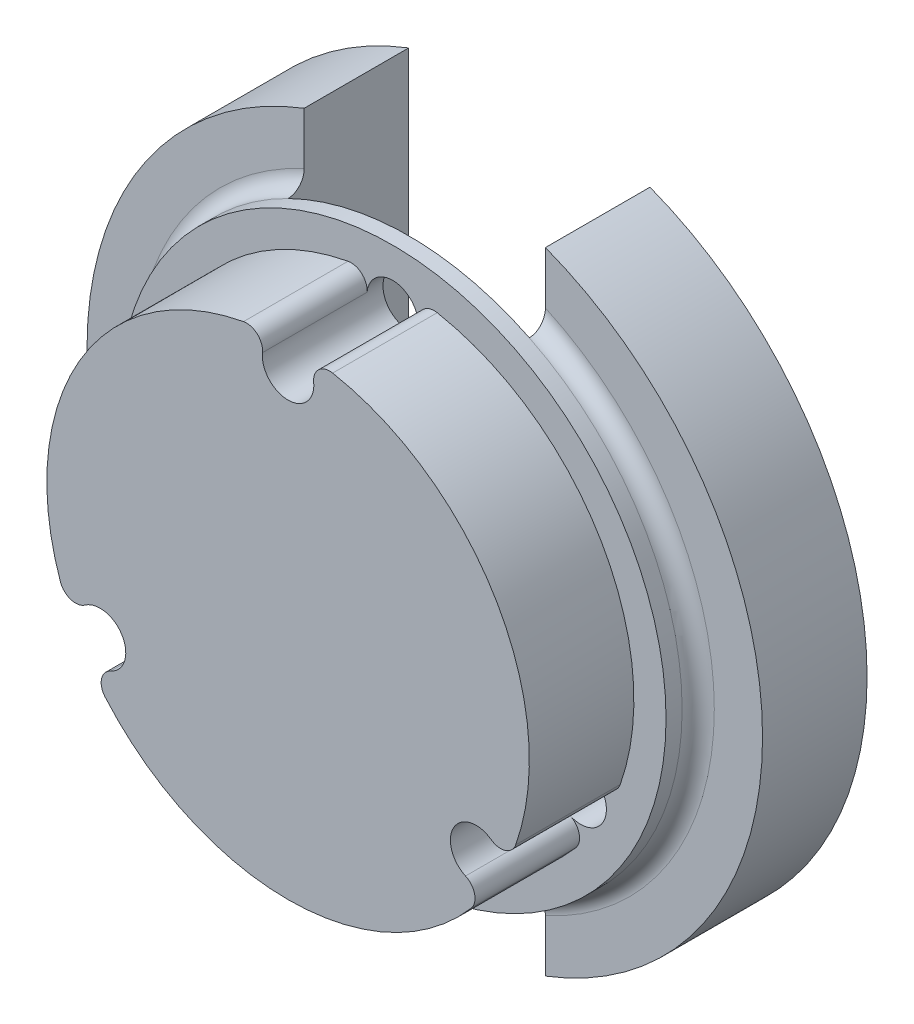
ISO-10303-21;
HEADER;
FILE_DESCRIPTION(('STEP AP214'),'2;1');
FILE_NAME('part.step','',(''),(''),'','','');
FILE_SCHEMA(('AUTOMOTIVE_DESIGN { 1 0 10303 214 1 1 1 1 }'));
ENDSEC;
DATA;
#1=APPLICATION_CONTEXT('core data for automotive mechanical design processes');
#2=APPLICATION_PROTOCOL_DEFINITION('international standard','automotive_design',2000,#1);
#3=PRODUCT_CONTEXT('',#1,'mechanical');
#4=PRODUCT('Part','Part','',(#3));
#5=PRODUCT_RELATED_PRODUCT_CATEGORY('part','',(#4));
#6=PRODUCT_DEFINITION_FORMATION('','',#4);
#7=PRODUCT_DEFINITION_CONTEXT('part definition',#1,'design');
#8=PRODUCT_DEFINITION('design','',#6,#7);
#9=PRODUCT_DEFINITION_SHAPE('','',#8);
#10=(LENGTH_UNIT() NAMED_UNIT(*) SI_UNIT(.MILLI.,.METRE.));
#11=(NAMED_UNIT(*) PLANE_ANGLE_UNIT() SI_UNIT($,.RADIAN.));
#12=(NAMED_UNIT(*) SI_UNIT($,.STERADIAN.) SOLID_ANGLE_UNIT());
#13=UNCERTAINTY_MEASURE_WITH_UNIT(LENGTH_MEASURE(1.E-05),#10,'distance_accuracy_value','');
#14=(GEOMETRIC_REPRESENTATION_CONTEXT(3) GLOBAL_UNCERTAINTY_ASSIGNED_CONTEXT((#13)) GLOBAL_UNIT_ASSIGNED_CONTEXT((#10,
#11,#12)) REPRESENTATION_CONTEXT('',''));
#15=CARTESIAN_POINT('',(0.,0.,0.));
#16=DIRECTION('',(0.,0.,1.));
#17=DIRECTION('',(1.,0.,0.));
#18=AXIS2_PLACEMENT_3D('',#15,#16,#17);
#19=CARTESIAN_POINT('',(0.,0.,-8.5));
#20=DIRECTION('',(0.,0.,1.));
#21=DIRECTION('',(1.,0.,0.));
#22=AXIS2_PLACEMENT_3D('',#19,#20,#21);
#23=CYLINDRICAL_SURFACE('',#22,21.);
#24=CARTESIAN_POINT('',(0.,0.,-2.));
#25=DIRECTION('',(0.,0.,1.));
#26=DIRECTION('',(1.,0.,0.));
#27=AXIS2_PLACEMENT_3D('',#24,#25,#26);
#28=CIRCLE('',#27,21.);
#29=CARTESIAN_POINT('',(-7.5,19.615045245933,-2.));
#30=VERTEX_POINT('',#29);
#31=CARTESIAN_POINT('',(-7.5,-19.615045245933,-2.));
#32=VERTEX_POINT('',#31);
#33=EDGE_CURVE('E489',#30,#32,#28,.T.);
#34=ORIENTED_EDGE('',*,*,#33,.F.);
#35=DIRECTION('',(0.,0.,1.));
#36=VECTOR('',#35,1.);
#37=CARTESIAN_POINT('',(-7.5,19.615045245933,-8.5));
#38=LINE('',#37,#36);
#39=CARTESIAN_POINT('',(-7.5,19.615045245933,-8.5));
#40=VERTEX_POINT('',#39);
#41=EDGE_CURVE('E466',#30,#40,#38,.F.);
#42=ORIENTED_EDGE('',*,*,#41,.T.);
#43=CARTESIAN_POINT('',(0.,0.,-8.5));
#44=DIRECTION('',(0.,0.,-1.));
#45=DIRECTION('',(-1.,0.,0.));
#46=AXIS2_PLACEMENT_3D('',#43,#44,#45);
#47=CIRCLE('',#46,21.);
#48=CARTESIAN_POINT('',(-7.5,-19.615045245933,-8.5));
#49=VERTEX_POINT('',#48);
#50=EDGE_CURVE('E439',#49,#40,#47,.T.);
#51=ORIENTED_EDGE('',*,*,#50,.F.);
#52=DIRECTION('',(0.,0.,1.));
#53=VECTOR('',#52,1.);
#54=CARTESIAN_POINT('',(-7.5,-19.615045245933,-8.5));
#55=LINE('',#54,#53);
#56=EDGE_CURVE('E459',#49,#32,#55,.T.);
#57=ORIENTED_EDGE('',*,*,#56,.T.);
#58=EDGE_LOOP('',(#34,#42,#51,#57));
#59=FACE_BOUND('',#58,.T.);
#60=ADVANCED_FACE('F45',(#59),#23,.T.);
#61=CARTESIAN_POINT('',(7.5,-19.615045245933,-2.));
#62=VERTEX_POINT('',#61);
#63=CARTESIAN_POINT('',(7.5,19.615045245933,-2.));
#64=VERTEX_POINT('',#63);
#65=EDGE_CURVE('E490',#62,#64,#28,.T.);
#66=ORIENTED_EDGE('',*,*,#65,.F.);
#67=DIRECTION('',(0.,0.,1.));
#68=VECTOR('',#67,1.);
#69=CARTESIAN_POINT('',(7.5,-19.615045245933,-8.5));
#70=LINE('',#69,#68);
#71=CARTESIAN_POINT('',(7.5,-19.615045245933,-8.5));
#72=VERTEX_POINT('',#71);
#73=EDGE_CURVE('E427',#62,#72,#70,.F.);
#74=ORIENTED_EDGE('',*,*,#73,.T.);
#75=CARTESIAN_POINT('',(7.5,19.615045245933,-8.5));
#76=VERTEX_POINT('',#75);
#77=EDGE_CURVE('E375',#76,#72,#47,.T.);
#78=ORIENTED_EDGE('',*,*,#77,.F.);
#79=DIRECTION('',(0.,0.,1.));
#80=VECTOR('',#79,1.);
#81=CARTESIAN_POINT('',(7.5,19.615045245933,-8.5));
#82=LINE('',#81,#80);
#83=EDGE_CURVE('E469',#76,#64,#82,.T.);
#84=ORIENTED_EDGE('',*,*,#83,.T.);
#85=EDGE_LOOP('',(#66,#74,#78,#84));
#86=FACE_BOUND('',#85,.T.);
#87=ADVANCED_FACE('F291',(#86),#23,.T.);
#88=CARTESIAN_POINT('',(0.,0.,0.));
#89=DIRECTION('',(0.,0.,-1.));
#90=DIRECTION('',(-1.,0.,0.));
#91=AXIS2_PLACEMENT_3D('',#88,#89,#90);
#92=PLANE('',#91);
#93=CARTESIAN_POINT('',(0.,0.,0.));
#94=DIRECTION('',(0.,0.,1.));
#95=DIRECTION('',(1.,0.,0.));
#96=AXIS2_PLACEMENT_3D('',#93,#94,#95);
#97=CIRCLE('',#96,15.);
#98=CARTESIAN_POINT('',(-2.7718701067851,14.7416666666667,0.));
#99=VERTEX_POINT('',#98);
#100=CARTESIAN_POINT('',(-14.1525928808485,-4.97032340486578,0.));
#101=VERTEX_POINT('',#100);
#102=EDGE_CURVE('E333',#99,#101,#97,.T.);
#103=ORIENTED_EDGE('',*,*,#102,.F.);
#104=CARTESIAN_POINT('',(-2.58707876633276,13.7588888888889,0.));
#105=DIRECTION('',(0.,0.,-1.));
#106=DIRECTION('',(-1.,0.,0.));
#107=AXIS2_PLACEMENT_3D('',#104,#105,#106);
#108=CIRCLE('',#107,1.);
#109=CARTESIAN_POINT('',(-1.5920484715894,13.6593162393162,0.));
#110=VERTEX_POINT('',#109);
#111=EDGE_CURVE('E330',#99,#110,#108,.T.);
#112=ORIENTED_EDGE('',*,*,#111,.T.);
#113=CARTESIAN_POINT('',(0.,13.5,0.));
#114=DIRECTION('',(0.,0.,-1.));
#115=DIRECTION('',(-1.,0.,0.));
#116=AXIS2_PLACEMENT_3D('',#113,#114,#115);
#117=CIRCLE('',#116,1.6);
#118=CARTESIAN_POINT('',(1.5920484715894,13.6593162393162,0.));
#119=VERTEX_POINT('',#118);
#120=EDGE_CURVE('E316',#110,#119,#117,.T.);
#121=ORIENTED_EDGE('',*,*,#120,.T.);
#122=CARTESIAN_POINT('',(2.58707876633276,13.7588888888889,0.));
#123=DIRECTION('',(0.,0.,-1.));
#124=DIRECTION('',(-1.,0.,0.));
#125=AXIS2_PLACEMENT_3D('',#122,#123,#124);
#126=CIRCLE('',#125,1.);
#127=CARTESIAN_POINT('',(2.7718701067851,14.7416666666667,0.));
#128=VERTEX_POINT('',#127);
#129=EDGE_CURVE('E210',#119,#128,#126,.T.);
#130=ORIENTED_EDGE('',*,*,#129,.T.);
#131=CARTESIAN_POINT('',(14.1525928808478,-4.97032340486769,0.));
#132=VERTEX_POINT('',#131);
#133=EDGE_CURVE('E364',#132,#128,#97,.T.);
#134=ORIENTED_EDGE('',*,*,#133,.F.);
#135=CARTESIAN_POINT('',(13.2090866887913,-4.63896851120985,0.));
#136=DIRECTION('',(0.,0.,-1.));
#137=DIRECTION('',(-1.,0.,0.));
#138=AXIS2_PLACEMENT_3D('',#135,#136,#137);
#139=CIRCLE('',#138,1.);
#140=CARTESIAN_POINT('',(12.6253390973674,-5.45090369920625,0.));
#141=VERTEX_POINT('',#140);
#142=EDGE_CURVE('E337',#132,#141,#139,.T.);
#143=ORIENTED_EDGE('',*,*,#142,.T.);
#144=CARTESIAN_POINT('',(11.6913429510891,-6.75000000000049,0.));
#145=DIRECTION('',(0.,0.,-1.));
#146=DIRECTION('',(-1.,0.,0.));
#147=AXIS2_PLACEMENT_3D('',#144,#145,#146);
#148=CIRCLE('',#147,1.6);
#149=CARTESIAN_POINT('',(11.0332906257778,-8.2084125401113,0.));
#150=VERTEX_POINT('',#149);
#151=EDGE_CURVE('E431',#141,#150,#148,.T.);
#152=ORIENTED_EDGE('',*,*,#151,.T.);
#153=CARTESIAN_POINT('',(10.6220079224583,-9.11992037768056,0.));
#154=DIRECTION('',(0.,0.,-1.));
#155=DIRECTION('',(-1.,0.,0.));
#156=AXIS2_PLACEMENT_3D('',#153,#154,#155);
#157=CIRCLE('',#156,1.);
#158=CARTESIAN_POINT('',(11.3807227740625,-9.7713432618006,0.));
#159=VERTEX_POINT('',#158);
#160=EDGE_CURVE('E355',#150,#159,#157,.T.);
#161=ORIENTED_EDGE('',*,*,#160,.T.);
#162=CARTESIAN_POINT('',(-11.3807227740636,-9.77134326179924,0.));
#163=VERTEX_POINT('',#162);
#164=EDGE_CURVE('E374',#163,#159,#97,.T.);
#165=ORIENTED_EDGE('',*,*,#164,.F.);
#166=CARTESIAN_POINT('',(-10.6220079224594,-9.11992037767929,0.));
#167=DIRECTION('',(0.,0.,-1.));
#168=DIRECTION('',(-1.,0.,0.));
#169=AXIS2_PLACEMENT_3D('',#166,#167,#168);
#170=CIRCLE('',#169,1.);
#171=CARTESIAN_POINT('',(-11.0332906257792,-8.20841254011014,0.));
#172=VERTEX_POINT('',#171);
#173=EDGE_CURVE('E342',#163,#172,#170,.T.);
#174=ORIENTED_EDGE('',*,*,#173,.T.);
#175=CARTESIAN_POINT('',(-11.6913429510908,-6.7499999999995,0.));
#176=DIRECTION('',(0.,0.,-1.));
#177=DIRECTION('',(-1.,0.,0.));
#178=AXIS2_PLACEMENT_3D('',#175,#176,#177);
#179=CIRCLE('',#178,1.6);
#180=CARTESIAN_POINT('',(-12.6253390973684,-5.45090369920477,0.));
#181=VERTEX_POINT('',#180);
#182=EDGE_CURVE('E327',#172,#181,#179,.T.);
#183=ORIENTED_EDGE('',*,*,#182,.T.);
#184=CARTESIAN_POINT('',(-13.2090866887919,-4.63896851120806,0.));
#185=DIRECTION('',(0.,0.,-1.));
#186=DIRECTION('',(-1.,0.,0.));
#187=AXIS2_PLACEMENT_3D('',#184,#185,#186);
#188=CIRCLE('',#187,1.);
#189=EDGE_CURVE('E347',#181,#101,#188,.T.);
#190=ORIENTED_EDGE('',*,*,#189,.T.);
#191=EDGE_LOOP('',(#103,#112,#121,#130,#134,#143,#152,#161,#165,#174,#183,#190));
#192=FACE_BOUND('',#191,.T.);
#193=CARTESIAN_POINT('',(0.,0.,0.));
#194=DIRECTION('',(0.,0.,1.));
#195=DIRECTION('',(1.,0.,0.));
#196=AXIS2_PLACEMENT_3D('',#193,#194,#195);
#197=CIRCLE('',#196,17.);
#198=CARTESIAN_POINT('',(17.,0.,0.));
#199=VERTEX_POINT('',#198);
#200=EDGE_CURVE('E493',#199,#199,#197,.T.);
#201=ORIENTED_EDGE('',*,*,#200,.T.);
#202=EDGE_LOOP('',(#201));
#203=FACE_BOUND('',#202,.T.);
#204=ADVANCED_FACE('F293',(#192,#203),#92,.F.);
#205=CARTESIAN_POINT('',(-7.5,-25.,-1.));
#206=DIRECTION('',(-1.,0.,0.));
#207=DIRECTION('',(0.,0.,1.));
#208=AXIS2_PLACEMENT_3D('',#205,#206,#207);
#209=PLANE('',#208);
#210=DIRECTION('',(0.,1.,0.));
#211=VECTOR('',#210,1.);
#212=CARTESIAN_POINT('',(-7.5,-25.,-2.));
#213=LINE('',#212,#211);
#214=CARTESIAN_POINT('',(-7.5,-16.3630681719536,-2.));
#215=VERTEX_POINT('',#214);
#216=EDGE_CURVE('E482',#32,#215,#213,.T.);
#217=ORIENTED_EDGE('',*,*,#216,.F.);
#218=ORIENTED_EDGE('',*,*,#56,.F.);
#219=DIRECTION('',(0.,1.,0.));
#220=VECTOR('',#219,1.);
#221=CARTESIAN_POINT('',(-7.5,-25.,-8.5));
#222=LINE('',#221,#220);
#223=EDGE_CURVE('E479',#49,#40,#222,.T.);
#224=ORIENTED_EDGE('',*,*,#223,.T.);
#225=ORIENTED_EDGE('',*,*,#41,.F.);
#226=CARTESIAN_POINT('',(-7.5,16.3630681719536,-2.));
#227=VERTEX_POINT('',#226);
#228=EDGE_CURVE('E486',#227,#30,#213,.T.);
#229=ORIENTED_EDGE('',*,*,#228,.F.);
#230=CARTESIAN_POINT('',(-7.5,16.3630681719536,-2.));
#231=CARTESIAN_POINT('',(-7.5,16.2958703614829,-2.0000213400489));
#232=CARTESIAN_POINT('',(-7.5,16.2286597714599,-1.99440257758259));
#233=CARTESIAN_POINT('',(-7.5,16.0959538245753,-1.97208049340124));
#234=CARTESIAN_POINT('',(-7.5,16.030462616216,-1.95535253979532));
#235=CARTESIAN_POINT('',(-7.5,15.9031736113708,-1.91098219102147));
#236=CARTESIAN_POINT('',(-7.5,15.8413804694591,-1.88332636086836));
#237=CARTESIAN_POINT('',(-7.5,15.7236692163626,-1.81755125479782));
#238=CARTESIAN_POINT('',(-7.5,15.6677457875231,-1.77944156465809));
#239=CARTESIAN_POINT('',(-7.5,15.5664206665172,-1.6955452343627));
#240=CARTESIAN_POINT('',(-7.5,15.5206429617394,-1.6502144898123));
#241=CARTESIAN_POINT('',(-7.5,15.4383756935423,-1.55173717647318));
#242=CARTESIAN_POINT('',(-7.5,15.4018833185516,-1.49859298128373));
#243=CARTESIAN_POINT('',(-7.5,15.3432574161808,-1.39178678130391));
#244=CARTESIAN_POINT('',(-7.5,15.3200495713483,-1.33871332360208));
#245=CARTESIAN_POINT('',(-7.5,15.2839582924566,-1.2292182665535));
#246=CARTESIAN_POINT('',(-7.5,15.271051140814,-1.17280468181757));
#247=CARTESIAN_POINT('',(-7.5,15.2611420539218,-1.09656195676813));
#248=CARTESIAN_POINT('',(-7.5,15.2592687956364,-1.07728293002192));
#249=CARTESIAN_POINT('',(-7.5,15.2567725672473,-1.03867264506556));
#250=CARTESIAN_POINT('',(-7.5,15.2561477565411,-1.01934150588482));
#251=CARTESIAN_POINT('',(-7.5,15.2561463023924,-1.));
#252=B_SPLINE_CURVE_WITH_KNOTS('',3,(#230,#231,#232,#233,#234,#235,#236,#237,#238,#239,#240,
#241,#242,#243,#244,#245,#246,#247,#248,#249,#250,#251),.UNSPECIFIED.,.F.,.F.,(4,2,2,2,2,2,2,2,
2,2,4),(0.,0.201385110988452,0.40321824126273,0.605300285804222,0.807197644949003,
0.99941110462578,1.19156629316846,1.36441438834829,1.53686333919624,1.59494283390534,
1.65293663789647),.UNSPECIFIED.);
#253=CARTESIAN_POINT('',(-7.5,15.2561463023924,-1.));
#254=VERTEX_POINT('',#253);
#255=EDGE_CURVE('E238',#227,#254,#252,.T.);
#256=ORIENTED_EDGE('',*,*,#255,.T.);
#257=DIRECTION('',(0.,1.,0.));
#258=VECTOR('',#257,1.);
#259=CARTESIAN_POINT('',(-7.5,-25.,-1.));
#260=LINE('',#259,#258);
#261=CARTESIAN_POINT('',(-7.5,-15.2561463023924,-1.));
#262=VERTEX_POINT('',#261);
#263=EDGE_CURVE('E215',#262,#254,#260,.T.);
#264=ORIENTED_EDGE('',*,*,#263,.F.);
#265=CARTESIAN_POINT('',(-7.5,-15.2561463023924,-1.));
#266=CARTESIAN_POINT('',(-7.5,-15.2561448866001,-1.02610100234969));
#267=CARTESIAN_POINT('',(-7.5,-15.257285839046,-1.05218862332931));
#268=CARTESIAN_POINT('',(-7.5,-15.2618267743395,-1.10415948141705));
#269=CARTESIAN_POINT('',(-7.5,-15.2652261405353,-1.13004277236519));
#270=CARTESIAN_POINT('',(-7.5,-15.2787341850511,-1.20691320046413));
#271=CARTESIAN_POINT('',(-7.5,-15.2921533351564,-1.25735549091556));
#272=CARTESIAN_POINT('',(-7.5,-15.3272106990856,-1.35521613797853));
#273=CARTESIAN_POINT('',(-7.5,-15.3488440493175,-1.40263626463412));
#274=CARTESIAN_POINT('',(-7.5,-15.3994528118032,-1.49340479901425));
#275=CARTESIAN_POINT('',(-7.5,-15.4284329897069,-1.53675053870204));
#276=CARTESIAN_POINT('',(-7.5,-15.4940680439291,-1.62021006613832));
#277=CARTESIAN_POINT('',(-7.5,-15.5309976099712,-1.66010705844828));
#278=CARTESIAN_POINT('',(-7.5,-15.6104938034295,-1.73380313449628));
#279=CARTESIAN_POINT('',(-7.5,-15.6530619400589,-1.76760057989466));
#280=CARTESIAN_POINT('',(-7.5,-15.7470126260077,-1.83159470190634));
#281=CARTESIAN_POINT('',(-7.5,-15.7988496639297,-1.86112384448984));
#282=CARTESIAN_POINT('',(-7.5,-15.9064518604337,-1.91189543549699));
#283=CARTESIAN_POINT('',(-7.5,-15.962219450178,-1.93313270109702));
#284=CARTESIAN_POINT('',(-7.5,-16.0749889430788,-1.96666648083779));
#285=CARTESIAN_POINT('',(-7.5,-16.1319340377427,-1.97915511911549));
#286=CARTESIAN_POINT('',(-7.5,-16.2469444973078,-1.99582147165792));
#287=CARTESIAN_POINT('',(-7.5,-16.3050081204244,-2.00001119547677));
#288=CARTESIAN_POINT('',(-7.5,-16.3630681719536,-2.));
#289=B_SPLINE_CURVE_WITH_KNOTS('',3,(#265,#266,#267,#268,#269,#270,#271,#272,#273,#274,#275,
#276,#277,#278,#279,#280,#281,#282,#283,#284,#285,#286,#287,#288),.UNSPECIFIED.,.F.,.F.,(4,2,2,
2,2,2,2,2,2,2,2,4),(0.,0.0782519471356355,0.156482536631858,0.312249404273295,0.467924186492867,
0.62370020946332,0.786122458319258,0.94858826910743,1.12681741052009,1.30515777609284,
1.47944730157554,1.65348442378612),.UNSPECIFIED.);
#290=EDGE_CURVE('E230',#262,#215,#289,.T.);
#291=ORIENTED_EDGE('',*,*,#290,.T.);
#292=EDGE_LOOP('',(#217,#218,#224,#225,#229,#256,#264,#291));
#293=FACE_BOUND('',#292,.T.);
#294=ADVANCED_FACE('F243',(#293),#209,.F.);
#295=CARTESIAN_POINT('',(7.5,-25.,-1.));
#296=DIRECTION('',(1.,0.,0.));
#297=DIRECTION('',(0.,0.,-1.));
#298=AXIS2_PLACEMENT_3D('',#295,#296,#297);
#299=PLANE('',#298);
#300=DIRECTION('',(0.,-1.,0.));
#301=VECTOR('',#300,1.);
#302=CARTESIAN_POINT('',(7.5,-25.,-2.));
#303=LINE('',#302,#301);
#304=CARTESIAN_POINT('',(7.5,16.3630681719536,-2.));
#305=VERTEX_POINT('',#304);
#306=EDGE_CURVE('E218',#64,#305,#303,.T.);
#307=ORIENTED_EDGE('',*,*,#306,.F.);
#308=ORIENTED_EDGE('',*,*,#83,.F.);
#309=DIRECTION('',(0.,-1.,0.));
#310=VECTOR('',#309,1.);
#311=CARTESIAN_POINT('',(7.5,-25.,-8.5));
#312=LINE('',#311,#310);
#313=EDGE_CURVE('E475',#76,#72,#312,.T.);
#314=ORIENTED_EDGE('',*,*,#313,.T.);
#315=ORIENTED_EDGE('',*,*,#73,.F.);
#316=CARTESIAN_POINT('',(7.5,-16.3630681719536,-2.));
#317=VERTEX_POINT('',#316);
#318=EDGE_CURVE('E191',#317,#62,#303,.T.);
#319=ORIENTED_EDGE('',*,*,#318,.F.);
#320=CARTESIAN_POINT('',(7.5,-16.3630681719536,-2.));
#321=CARTESIAN_POINT('',(7.5,-16.2958703614829,-2.0000213400489));
#322=CARTESIAN_POINT('',(7.5,-16.2286597714599,-1.99440257758259));
#323=CARTESIAN_POINT('',(7.5,-16.0959538245753,-1.97208049340124));
#324=CARTESIAN_POINT('',(7.5,-16.030462616216,-1.95535253979532));
#325=CARTESIAN_POINT('',(7.5,-15.9031736113708,-1.91098219102147));
#326=CARTESIAN_POINT('',(7.5,-15.8413804694591,-1.88332636086836));
#327=CARTESIAN_POINT('',(7.5,-15.7236692163626,-1.81755125479782));
#328=CARTESIAN_POINT('',(7.5,-15.6677457875231,-1.77944156465809));
#329=CARTESIAN_POINT('',(7.5,-15.5664206665172,-1.6955452343627));
#330=CARTESIAN_POINT('',(7.5,-15.5206429617394,-1.6502144898123));
#331=CARTESIAN_POINT('',(7.5,-15.4383756935423,-1.55173717647318));
#332=CARTESIAN_POINT('',(7.5,-15.4018833185516,-1.49859298128373));
#333=CARTESIAN_POINT('',(7.5,-15.3432574161808,-1.39178678130391));
#334=CARTESIAN_POINT('',(7.5,-15.3200495713483,-1.33871332360208));
#335=CARTESIAN_POINT('',(7.5,-15.2839582924566,-1.2292182665535));
#336=CARTESIAN_POINT('',(7.5,-15.271051140814,-1.17280468181757));
#337=CARTESIAN_POINT('',(7.5,-15.2611420539218,-1.09656195676813));
#338=CARTESIAN_POINT('',(7.5,-15.2592687956364,-1.07728293002192));
#339=CARTESIAN_POINT('',(7.5,-15.2567725672473,-1.03867264506556));
#340=CARTESIAN_POINT('',(7.5,-15.2561477565411,-1.01934150588482));
#341=CARTESIAN_POINT('',(7.5,-15.2561463023924,-1.));
#342=B_SPLINE_CURVE_WITH_KNOTS('',3,(#320,#321,#322,#323,#324,#325,#326,#327,#328,#329,#330,
#331,#332,#333,#334,#335,#336,#337,#338,#339,#340,#341),.UNSPECIFIED.,.F.,.F.,(4,2,2,2,2,2,2,2,
2,2,4),(0.,0.201385110988452,0.40321824126273,0.605300285804222,0.807197644949003,
0.99941110462578,1.19156629316846,1.36441438834829,1.53686333919624,1.59494283390534,
1.65293663789647),.UNSPECIFIED.);
#343=CARTESIAN_POINT('',(7.5,-15.2561463023924,-1.));
#344=VERTEX_POINT('',#343);
#345=EDGE_CURVE('E11',#317,#344,#342,.T.);
#346=ORIENTED_EDGE('',*,*,#345,.T.);
#347=DIRECTION('',(0.,-1.,0.));
#348=VECTOR('',#347,1.);
#349=CARTESIAN_POINT('',(7.5,-25.,-1.));
#350=LINE('',#349,#348);
#351=CARTESIAN_POINT('',(7.5,15.2561463023924,-1.));
#352=VERTEX_POINT('',#351);
#353=EDGE_CURVE('E189',#352,#344,#350,.T.);
#354=ORIENTED_EDGE('',*,*,#353,.F.);
#355=CARTESIAN_POINT('',(7.5,15.2561463023924,-1.));
#356=CARTESIAN_POINT('',(7.5,15.2561448866001,-1.02610100234969));
#357=CARTESIAN_POINT('',(7.5,15.257285839046,-1.05218862332931));
#358=CARTESIAN_POINT('',(7.5,15.2618267743395,-1.10415948141705));
#359=CARTESIAN_POINT('',(7.5,15.2652261405353,-1.13004277236519));
#360=CARTESIAN_POINT('',(7.5,15.2787341850511,-1.20691320046413));
#361=CARTESIAN_POINT('',(7.5,15.2921533351564,-1.25735549091556));
#362=CARTESIAN_POINT('',(7.5,15.3272106990856,-1.35521613797853));
#363=CARTESIAN_POINT('',(7.5,15.3488440493175,-1.40263626463412));
#364=CARTESIAN_POINT('',(7.5,15.3994528118032,-1.49340479901425));
#365=CARTESIAN_POINT('',(7.5,15.4284329897069,-1.53675053870204));
#366=CARTESIAN_POINT('',(7.5,15.4940680439291,-1.62021006613832));
#367=CARTESIAN_POINT('',(7.5,15.5309976099712,-1.66010705844828));
#368=CARTESIAN_POINT('',(7.5,15.6104938034295,-1.73380313449628));
#369=CARTESIAN_POINT('',(7.5,15.6530619400589,-1.76760057989466));
#370=CARTESIAN_POINT('',(7.5,15.7470126260077,-1.83159470190634));
#371=CARTESIAN_POINT('',(7.5,15.7988496639297,-1.86112384448984));
#372=CARTESIAN_POINT('',(7.5,15.9064518604337,-1.91189543549699));
#373=CARTESIAN_POINT('',(7.5,15.962219450178,-1.93313270109702));
#374=CARTESIAN_POINT('',(7.5,16.0749889430788,-1.96666648083779));
#375=CARTESIAN_POINT('',(7.5,16.1319340377427,-1.97915511911549));
#376=CARTESIAN_POINT('',(7.5,16.2469444973078,-1.99582147165792));
#377=CARTESIAN_POINT('',(7.5,16.3050081204244,-2.00001119547677));
#378=CARTESIAN_POINT('',(7.5,16.3630681719536,-2.));
#379=B_SPLINE_CURVE_WITH_KNOTS('',3,(#355,#356,#357,#358,#359,#360,#361,#362,#363,#364,#365,
#366,#367,#368,#369,#370,#371,#372,#373,#374,#375,#376,#377,#378),.UNSPECIFIED.,.F.,.F.,(4,2,2,
2,2,2,2,2,2,2,2,4),(0.,0.0782519471356355,0.156482536631858,0.312249404273295,0.467924186492867,
0.62370020946332,0.786122458319258,0.94858826910743,1.12681741052009,1.30515777609284,
1.47944730157554,1.65348442378612),.UNSPECIFIED.);
#380=EDGE_CURVE('E60',#352,#305,#379,.T.);
#381=ORIENTED_EDGE('',*,*,#380,.T.);
#382=EDGE_LOOP('',(#307,#308,#314,#315,#319,#346,#354,#381));
#383=FACE_BOUND('',#382,.T.);
#384=ADVANCED_FACE('F187',(#383),#299,.F.);
#385=CARTESIAN_POINT('',(0.,0.,-1.));
#386=DIRECTION('',(0.,0.,1.));
#387=DIRECTION('',(1.,0.,0.));
#388=AXIS2_PLACEMENT_3D('',#385,#386,#387);
#389=PLANE('',#388);
#390=CARTESIAN_POINT('',(0.,13.5,-1.));
#391=DIRECTION('',(0.,0.,1.));
#392=DIRECTION('',(1.,0.,0.));
#393=AXIS2_PLACEMENT_3D('',#390,#391,#392);
#394=CIRCLE('',#393,1.6);
#395=CARTESIAN_POINT('',(1.6,13.5,-1.));
#396=VERTEX_POINT('',#395);
#397=EDGE_CURVE('E214',#396,#396,#394,.F.);
#398=ORIENTED_EDGE('',*,*,#397,.F.);
#399=EDGE_LOOP('',(#398));
#400=FACE_BOUND('',#399,.T.);
#401=CARTESIAN_POINT('',(0.,0.,-1.));
#402=DIRECTION('',(0.,0.,1.));
#403=DIRECTION('',(1.,0.,0.));
#404=AXIS2_PLACEMENT_3D('',#401,#402,#403);
#405=CIRCLE('',#404,17.);
#406=EDGE_CURVE('E209',#352,#254,#405,.T.);
#407=ORIENTED_EDGE('',*,*,#406,.F.);
#408=ORIENTED_EDGE('',*,*,#353,.T.);
#409=EDGE_CURVE('E198',#262,#344,#405,.T.);
#410=ORIENTED_EDGE('',*,*,#409,.F.);
#411=ORIENTED_EDGE('',*,*,#263,.T.);
#412=EDGE_LOOP('',(#407,#408,#410,#411));
#413=FACE_BOUND('',#412,.T.);
#414=ADVANCED_FACE('F212',(#400,#413),#389,.F.);
#415=CARTESIAN_POINT('',(0.,0.,-8.5));
#416=DIRECTION('',(0.,0.,-1.));
#417=DIRECTION('',(-1.,0.,0.));
#418=AXIS2_PLACEMENT_3D('',#415,#416,#417);
#419=PLANE('',#418);
#420=ORIENTED_EDGE('',*,*,#223,.F.);
#421=ORIENTED_EDGE('',*,*,#50,.T.);
#422=EDGE_LOOP('',(#420,#421));
#423=FACE_BOUND('',#422,.T.);
#424=CARTESIAN_POINT('',(-11.6913429510908,-6.7499999999995,-8.5));
#425=DIRECTION('',(0.,0.,-1.));
#426=DIRECTION('',(-1.,0.,0.));
#427=AXIS2_PLACEMENT_3D('',#424,#425,#426);
#428=CIRCLE('',#427,1.6);
#429=CARTESIAN_POINT('',(-13.2913429510908,-6.7499999999995,-8.5));
#430=VERTEX_POINT('',#429);
#431=EDGE_CURVE('E454',#430,#430,#428,.T.);
#432=ORIENTED_EDGE('',*,*,#431,.F.);
#433=EDGE_LOOP('',(#432));
#434=FACE_BOUND('',#433,.T.);
#435=ADVANCED_FACE('F301',(#423,#434),#419,.T.);
#436=CARTESIAN_POINT('',(0.,0.,6.5));
#437=DIRECTION('',(0.,0.,-1.));
#438=DIRECTION('',(-1.,0.,0.));
#439=AXIS2_PLACEMENT_3D('',#436,#437,#438);
#440=CYLINDRICAL_SURFACE('',#439,15.);
#441=CARTESIAN_POINT('',(0.,0.,6.5));
#442=DIRECTION('',(0.,0.,1.));
#443=DIRECTION('',(1.,0.,0.));
#444=AXIS2_PLACEMENT_3D('',#441,#442,#443);
#445=CIRCLE('',#444,15.);
#446=CARTESIAN_POINT('',(14.1525928808478,-4.97032340486769,6.5));
#447=VERTEX_POINT('',#446);
#448=CARTESIAN_POINT('',(2.7718701067851,14.7416666666667,6.5));
#449=VERTEX_POINT('',#448);
#450=EDGE_CURVE('E435',#447,#449,#445,.T.);
#451=ORIENTED_EDGE('',*,*,#450,.F.);
#452=DIRECTION('',(0.,0.,-1.));
#453=VECTOR('',#452,1.);
#454=CARTESIAN_POINT('',(14.1525928808478,-4.97032340486769,6.5));
#455=LINE('',#454,#453);
#456=EDGE_CURVE('E349',#447,#132,#455,.T.);
#457=ORIENTED_EDGE('',*,*,#456,.T.);
#458=ORIENTED_EDGE('',*,*,#133,.T.);
#459=DIRECTION('',(0.,0.,-1.));
#460=VECTOR('',#459,1.);
#461=CARTESIAN_POINT('',(2.7718701067851,14.7416666666667,6.5));
#462=LINE('',#461,#460);
#463=EDGE_CURVE('E370',#128,#449,#462,.F.);
#464=ORIENTED_EDGE('',*,*,#463,.T.);
#465=EDGE_LOOP('',(#451,#457,#458,#464));
#466=FACE_BOUND('',#465,.T.);
#467=ADVANCED_FACE('F284',(#466),#440,.T.);
#468=ORIENTED_EDGE('',*,*,#102,.T.);
#469=DIRECTION('',(0.,0.,-1.));
#470=VECTOR('',#469,1.);
#471=CARTESIAN_POINT('',(-14.1525928808485,-4.97032340486578,6.5));
#472=LINE('',#471,#470);
#473=CARTESIAN_POINT('',(-14.1525928808485,-4.97032340486578,6.5));
#474=VERTEX_POINT('',#473);
#475=EDGE_CURVE('E389',#101,#474,#472,.F.);
#476=ORIENTED_EDGE('',*,*,#475,.T.);
#477=CARTESIAN_POINT('',(-2.7718701067851,14.7416666666667,6.5));
#478=VERTEX_POINT('',#477);
#479=EDGE_CURVE('E433',#478,#474,#445,.T.);
#480=ORIENTED_EDGE('',*,*,#479,.F.);
#481=DIRECTION('',(0.,0.,-1.));
#482=VECTOR('',#481,1.);
#483=CARTESIAN_POINT('',(-2.7718701067851,14.7416666666667,6.5));
#484=LINE('',#483,#482);
#485=EDGE_CURVE('E393',#478,#99,#484,.T.);
#486=ORIENTED_EDGE('',*,*,#485,.T.);
#487=EDGE_LOOP('',(#468,#476,#480,#486));
#488=FACE_BOUND('',#487,.T.);
#489=ADVANCED_FACE('F282',(#488),#440,.T.);
#490=CARTESIAN_POINT('',(-11.3807227740636,-9.77134326179924,6.5));
#491=VERTEX_POINT('',#490);
#492=CARTESIAN_POINT('',(11.3807227740625,-9.7713432618006,6.5));
#493=VERTEX_POINT('',#492);
#494=EDGE_CURVE('E438',#491,#493,#445,.T.);
#495=ORIENTED_EDGE('',*,*,#494,.F.);
#496=DIRECTION('',(0.,0.,-1.));
#497=VECTOR('',#496,1.);
#498=CARTESIAN_POINT('',(-11.3807227740636,-9.77134326179924,6.5));
#499=LINE('',#498,#497);
#500=EDGE_CURVE('E419',#491,#163,#499,.T.);
#501=ORIENTED_EDGE('',*,*,#500,.T.);
#502=ORIENTED_EDGE('',*,*,#164,.T.);
#503=DIRECTION('',(0.,0.,-1.));
#504=VECTOR('',#503,1.);
#505=CARTESIAN_POINT('',(11.3807227740625,-9.7713432618006,6.5));
#506=LINE('',#505,#504);
#507=EDGE_CURVE('E326',#159,#493,#506,.F.);
#508=ORIENTED_EDGE('',*,*,#507,.T.);
#509=EDGE_LOOP('',(#495,#501,#502,#508));
#510=FACE_BOUND('',#509,.T.);
#511=ADVANCED_FACE('F278',(#510),#440,.T.);
#512=CARTESIAN_POINT('',(0.,0.,6.5));
#513=DIRECTION('',(0.,0.,1.));
#514=DIRECTION('',(1.,0.,0.));
#515=AXIS2_PLACEMENT_3D('',#512,#513,#514);
#516=PLANE('',#515);
#517=CARTESIAN_POINT('',(-11.6913429510908,-6.7499999999995,6.5));
#518=DIRECTION('',(0.,0.,1.));
#519=DIRECTION('',(1.,0.,0.));
#520=AXIS2_PLACEMENT_3D('',#517,#518,#519);
#521=CIRCLE('',#520,1.6);
#522=CARTESIAN_POINT('',(-11.0332906257792,-8.20841254011014,6.5));
#523=VERTEX_POINT('',#522);
#524=CARTESIAN_POINT('',(-12.6253390973684,-5.45090369920477,6.5));
#525=VERTEX_POINT('',#524);
#526=EDGE_CURVE('E446',#523,#525,#521,.T.);
#527=ORIENTED_EDGE('',*,*,#526,.F.);
#528=CARTESIAN_POINT('',(-10.6220079224594,-9.11992037767929,6.5));
#529=DIRECTION('',(0.,0.,1.));
#530=DIRECTION('',(1.,0.,0.));
#531=AXIS2_PLACEMENT_3D('',#528,#529,#530);
#532=CIRCLE('',#531,1.);
#533=EDGE_CURVE('E396',#523,#491,#532,.T.);
#534=ORIENTED_EDGE('',*,*,#533,.T.);
#535=ORIENTED_EDGE('',*,*,#494,.T.);
#536=CARTESIAN_POINT('',(10.6220079224583,-9.11992037768056,6.5));
#537=DIRECTION('',(0.,0.,1.));
#538=DIRECTION('',(1.,0.,0.));
#539=AXIS2_PLACEMENT_3D('',#536,#537,#538);
#540=CIRCLE('',#539,1.);
#541=CARTESIAN_POINT('',(11.0332906257778,-8.2084125401113,6.5));
#542=VERTEX_POINT('',#541);
#543=EDGE_CURVE('E402',#493,#542,#540,.T.);
#544=ORIENTED_EDGE('',*,*,#543,.T.);
#545=CARTESIAN_POINT('',(11.6913429510891,-6.75000000000049,6.5));
#546=DIRECTION('',(0.,0.,1.));
#547=DIRECTION('',(1.,0.,0.));
#548=AXIS2_PLACEMENT_3D('',#545,#546,#547);
#549=CIRCLE('',#548,1.6);
#550=CARTESIAN_POINT('',(12.6253390973674,-5.45090369920625,6.5));
#551=VERTEX_POINT('',#550);
#552=EDGE_CURVE('E450',#551,#542,#549,.T.);
#553=ORIENTED_EDGE('',*,*,#552,.F.);
#554=CARTESIAN_POINT('',(13.2090866887913,-4.63896851120985,6.5));
#555=DIRECTION('',(0.,0.,1.));
#556=DIRECTION('',(1.,0.,0.));
#557=AXIS2_PLACEMENT_3D('',#554,#555,#556);
#558=CIRCLE('',#557,1.);
#559=EDGE_CURVE('E405',#551,#447,#558,.T.);
#560=ORIENTED_EDGE('',*,*,#559,.T.);
#561=ORIENTED_EDGE('',*,*,#450,.T.);
#562=CARTESIAN_POINT('',(2.58707876633276,13.7588888888889,6.5));
#563=DIRECTION('',(0.,0.,1.));
#564=DIRECTION('',(1.,0.,0.));
#565=AXIS2_PLACEMENT_3D('',#562,#563,#564);
#566=CIRCLE('',#565,1.);
#567=CARTESIAN_POINT('',(1.5920484715894,13.6593162393162,6.5));
#568=VERTEX_POINT('',#567);
#569=EDGE_CURVE('E377',#449,#568,#566,.T.);
#570=ORIENTED_EDGE('',*,*,#569,.T.);
#571=CARTESIAN_POINT('',(0.,13.5,6.5));
#572=DIRECTION('',(0.,0.,1.));
#573=DIRECTION('',(1.,0.,0.));
#574=AXIS2_PLACEMENT_3D('',#571,#572,#573);
#575=CIRCLE('',#574,1.6);
#576=CARTESIAN_POINT('',(-1.5920484715894,13.6593162393162,6.5));
#577=VERTEX_POINT('',#576);
#578=EDGE_CURVE('E443',#577,#568,#575,.T.);
#579=ORIENTED_EDGE('',*,*,#578,.F.);
#580=CARTESIAN_POINT('',(-2.58707876633276,13.7588888888889,6.5));
#581=DIRECTION('',(0.,0.,1.));
#582=DIRECTION('',(1.,0.,0.));
#583=AXIS2_PLACEMENT_3D('',#580,#581,#582);
#584=CIRCLE('',#583,1.);
#585=EDGE_CURVE('E340',#577,#478,#584,.T.);
#586=ORIENTED_EDGE('',*,*,#585,.T.);
#587=ORIENTED_EDGE('',*,*,#479,.T.);
#588=CARTESIAN_POINT('',(-13.2090866887919,-4.63896851120806,6.5));
#589=DIRECTION('',(0.,0.,1.));
#590=DIRECTION('',(1.,0.,0.));
#591=AXIS2_PLACEMENT_3D('',#588,#589,#590);
#592=CIRCLE('',#591,1.);
#593=EDGE_CURVE('E399',#474,#525,#592,.T.);
#594=ORIENTED_EDGE('',*,*,#593,.T.);
#595=EDGE_LOOP('',(#527,#534,#535,#544,#553,#560,#561,#570,#579,#586,#587,#594));
#596=FACE_BOUND('',#595,.T.);
#597=ADVANCED_FACE('F281',(#596),#516,.T.);
#598=ORIENTED_EDGE('',*,*,#313,.F.);
#599=ORIENTED_EDGE('',*,*,#77,.T.);
#600=EDGE_LOOP('',(#598,#599));
#601=FACE_BOUND('',#600,.T.);
#602=CARTESIAN_POINT('',(11.6913429510891,-6.75000000000049,-8.5));
#603=DIRECTION('',(0.,0.,-1.));
#604=DIRECTION('',(-1.,0.,0.));
#605=AXIS2_PLACEMENT_3D('',#602,#603,#604);
#606=CIRCLE('',#605,1.6);
#607=CARTESIAN_POINT('',(10.0913429510891,-6.75000000000049,-8.5));
#608=VERTEX_POINT('',#607);
#609=EDGE_CURVE('E455',#608,#608,#606,.T.);
#610=ORIENTED_EDGE('',*,*,#609,.F.);
#611=EDGE_LOOP('',(#610));
#612=FACE_BOUND('',#611,.T.);
#613=ADVANCED_FACE('F287',(#601,#612),#419,.T.);
#614=CARTESIAN_POINT('',(11.6913429510891,-6.75000000000049,18.));
#615=DIRECTION('',(0.,0.,-1.));
#616=DIRECTION('',(-1.,0.,0.));
#617=AXIS2_PLACEMENT_3D('',#614,#615,#616);
#618=CYLINDRICAL_SURFACE('',#617,1.6);
#619=ORIENTED_EDGE('',*,*,#552,.T.);
#620=DIRECTION('',(0.,0.,-1.));
#621=VECTOR('',#620,1.);
#622=CARTESIAN_POINT('',(11.0332906257778,-8.2084125401113,18.));
#623=LINE('',#622,#621);
#624=EDGE_CURVE('E379',#542,#150,#623,.T.);
#625=ORIENTED_EDGE('',*,*,#624,.T.);
#626=ORIENTED_EDGE('',*,*,#151,.F.);
#627=DIRECTION('',(0.,0.,-1.));
#628=VECTOR('',#627,1.);
#629=CARTESIAN_POINT('',(12.6253390973674,-5.45090369920625,18.));
#630=LINE('',#629,#628);
#631=EDGE_CURVE('E384',#141,#551,#630,.F.);
#632=ORIENTED_EDGE('',*,*,#631,.T.);
#633=EDGE_LOOP('',(#619,#625,#626,#632));
#634=FACE_BOUND('',#633,.T.);
#635=ORIENTED_EDGE('',*,*,#609,.T.);
#636=EDGE_LOOP('',(#635));
#637=FACE_BOUND('',#636,.T.);
#638=ADVANCED_FACE('F299',(#634,#637),#618,.F.);
#639=CARTESIAN_POINT('',(-11.6913429510908,-6.7499999999995,18.));
#640=DIRECTION('',(0.,0.,-1.));
#641=DIRECTION('',(-1.,0.,0.));
#642=AXIS2_PLACEMENT_3D('',#639,#640,#641);
#643=CYLINDRICAL_SURFACE('',#642,1.6);
#644=ORIENTED_EDGE('',*,*,#182,.F.);
#645=DIRECTION('',(0.,0.,-1.));
#646=VECTOR('',#645,1.);
#647=CARTESIAN_POINT('',(-11.0332906257792,-8.20841254011014,18.));
#648=LINE('',#647,#646);
#649=EDGE_CURVE('E412',#172,#523,#648,.F.);
#650=ORIENTED_EDGE('',*,*,#649,.T.);
#651=ORIENTED_EDGE('',*,*,#526,.T.);
#652=DIRECTION('',(0.,0.,-1.));
#653=VECTOR('',#652,1.);
#654=CARTESIAN_POINT('',(-12.6253390973684,-5.45090369920477,18.));
#655=LINE('',#654,#653);
#656=EDGE_CURVE('E415',#525,#181,#655,.T.);
#657=ORIENTED_EDGE('',*,*,#656,.T.);
#658=EDGE_LOOP('',(#644,#650,#651,#657));
#659=FACE_BOUND('',#658,.T.);
#660=ORIENTED_EDGE('',*,*,#431,.T.);
#661=EDGE_LOOP('',(#660));
#662=FACE_BOUND('',#661,.T.);
#663=ADVANCED_FACE('F304',(#659,#662),#643,.F.);
#664=CARTESIAN_POINT('',(0.,13.5,18.));
#665=DIRECTION('',(0.,0.,-1.));
#666=DIRECTION('',(-1.,0.,0.));
#667=AXIS2_PLACEMENT_3D('',#664,#665,#666);
#668=CYLINDRICAL_SURFACE('',#667,1.6);
#669=ORIENTED_EDGE('',*,*,#397,.T.);
#670=EDGE_LOOP('',(#669));
#671=FACE_BOUND('',#670,.T.);
#672=ORIENTED_EDGE('',*,*,#120,.F.);
#673=DIRECTION('',(0.,0.,-1.));
#674=VECTOR('',#673,1.);
#675=CARTESIAN_POINT('',(-1.5920484715894,13.6593162393162,18.));
#676=LINE('',#675,#674);
#677=EDGE_CURVE('E320',#110,#577,#676,.F.);
#678=ORIENTED_EDGE('',*,*,#677,.T.);
#679=ORIENTED_EDGE('',*,*,#578,.T.);
#680=DIRECTION('',(0.,0.,-1.));
#681=VECTOR('',#680,1.);
#682=CARTESIAN_POINT('',(1.5920484715894,13.6593162393162,18.));
#683=LINE('',#682,#681);
#684=EDGE_CURVE('E323',#568,#119,#683,.T.);
#685=ORIENTED_EDGE('',*,*,#684,.T.);
#686=EDGE_LOOP('',(#672,#678,#679,#685));
#687=FACE_BOUND('',#686,.T.);
#688=ADVANCED_FACE('F276',(#671,#687),#668,.F.);
#689=CARTESIAN_POINT('',(-10.6220079224594,-9.11992037767929,18.));
#690=DIRECTION('',(0.,0.,1.));
#691=DIRECTION('',(1.,0.,0.));
#692=AXIS2_PLACEMENT_3D('',#689,#690,#691);
#693=CYLINDRICAL_SURFACE('',#692,1.);
#694=ORIENTED_EDGE('',*,*,#533,.F.);
#695=ORIENTED_EDGE('',*,*,#649,.F.);
#696=ORIENTED_EDGE('',*,*,#173,.F.);
#697=ORIENTED_EDGE('',*,*,#500,.F.);
#698=EDGE_LOOP('',(#694,#695,#696,#697));
#699=FACE_BOUND('',#698,.T.);
#700=ADVANCED_FACE('F272',(#699),#693,.T.);
#701=CARTESIAN_POINT('',(-13.2090866887919,-4.63896851120806,18.));
#702=DIRECTION('',(0.,0.,-1.));
#703=DIRECTION('',(-1.,0.,0.));
#704=AXIS2_PLACEMENT_3D('',#701,#702,#703);
#705=CYLINDRICAL_SURFACE('',#704,1.);
#706=ORIENTED_EDGE('',*,*,#189,.F.);
#707=ORIENTED_EDGE('',*,*,#656,.F.);
#708=ORIENTED_EDGE('',*,*,#593,.F.);
#709=ORIENTED_EDGE('',*,*,#475,.F.);
#710=EDGE_LOOP('',(#706,#707,#708,#709));
#711=FACE_BOUND('',#710,.T.);
#712=ADVANCED_FACE('F268',(#711),#705,.T.);
#713=CARTESIAN_POINT('',(10.6220079224583,-9.11992037768056,18.));
#714=DIRECTION('',(0.,0.,-1.));
#715=DIRECTION('',(-1.,0.,0.));
#716=AXIS2_PLACEMENT_3D('',#713,#714,#715);
#717=CYLINDRICAL_SURFACE('',#716,1.);
#718=ORIENTED_EDGE('',*,*,#160,.F.);
#719=ORIENTED_EDGE('',*,*,#624,.F.);
#720=ORIENTED_EDGE('',*,*,#543,.F.);
#721=ORIENTED_EDGE('',*,*,#507,.F.);
#722=EDGE_LOOP('',(#718,#719,#720,#721));
#723=FACE_BOUND('',#722,.T.);
#724=ADVANCED_FACE('F264',(#723),#717,.T.);
#725=CARTESIAN_POINT('',(13.2090866887913,-4.63896851120985,18.));
#726=DIRECTION('',(0.,0.,1.));
#727=DIRECTION('',(1.,0.,0.));
#728=AXIS2_PLACEMENT_3D('',#725,#726,#727);
#729=CYLINDRICAL_SURFACE('',#728,1.);
#730=ORIENTED_EDGE('',*,*,#559,.F.);
#731=ORIENTED_EDGE('',*,*,#631,.F.);
#732=ORIENTED_EDGE('',*,*,#142,.F.);
#733=ORIENTED_EDGE('',*,*,#456,.F.);
#734=EDGE_LOOP('',(#730,#731,#732,#733));
#735=FACE_BOUND('',#734,.T.);
#736=ADVANCED_FACE('F260',(#735),#729,.T.);
#737=CARTESIAN_POINT('',(-2.58707876633276,13.7588888888889,18.));
#738=DIRECTION('',(0.,0.,1.));
#739=DIRECTION('',(1.,0.,0.));
#740=AXIS2_PLACEMENT_3D('',#737,#738,#739);
#741=CYLINDRICAL_SURFACE('',#740,1.);
#742=ORIENTED_EDGE('',*,*,#585,.F.);
#743=ORIENTED_EDGE('',*,*,#677,.F.);
#744=ORIENTED_EDGE('',*,*,#111,.F.);
#745=ORIENTED_EDGE('',*,*,#485,.F.);
#746=EDGE_LOOP('',(#742,#743,#744,#745));
#747=FACE_BOUND('',#746,.T.);
#748=ADVANCED_FACE('F256',(#747),#741,.T.);
#749=CARTESIAN_POINT('',(2.58707876633276,13.7588888888889,18.));
#750=DIRECTION('',(0.,0.,-1.));
#751=DIRECTION('',(-1.,0.,0.));
#752=AXIS2_PLACEMENT_3D('',#749,#750,#751);
#753=CYLINDRICAL_SURFACE('',#752,1.);
#754=ORIENTED_EDGE('',*,*,#129,.F.);
#755=ORIENTED_EDGE('',*,*,#684,.F.);
#756=ORIENTED_EDGE('',*,*,#569,.F.);
#757=ORIENTED_EDGE('',*,*,#463,.F.);
#758=EDGE_LOOP('',(#754,#755,#756,#757));
#759=FACE_BOUND('',#758,.T.);
#760=ADVANCED_FACE('F251',(#759),#753,.T.);
#761=CARTESIAN_POINT('',(0.,0.,-2.));
#762=DIRECTION('',(0.,0.,1.));
#763=DIRECTION('',(1.,0.,0.));
#764=AXIS2_PLACEMENT_3D('',#761,#762,#763);
#765=PLANE('',#764);
#766=ORIENTED_EDGE('',*,*,#216,.T.);
#767=CARTESIAN_POINT('',(0.,0.,-2.));
#768=DIRECTION('',(0.,0.,1.));
#769=DIRECTION('',(1.,0.,0.));
#770=AXIS2_PLACEMENT_3D('',#767,#768,#769);
#771=CIRCLE('',#770,18.);
#772=EDGE_CURVE('E222',#215,#227,#771,.F.);
#773=ORIENTED_EDGE('',*,*,#772,.T.);
#774=ORIENTED_EDGE('',*,*,#228,.T.);
#775=ORIENTED_EDGE('',*,*,#33,.T.);
#776=EDGE_LOOP('',(#766,#773,#774,#775));
#777=FACE_BOUND('',#776,.T.);
#778=ADVANCED_FACE('F255',(#777),#765,.T.);
#779=ORIENTED_EDGE('',*,*,#306,.T.);
#780=CARTESIAN_POINT('',(0.,0.,-2.));
#781=DIRECTION('',(0.,0.,1.));
#782=DIRECTION('',(1.,0.,0.));
#783=AXIS2_PLACEMENT_3D('',#780,#781,#782);
#784=CIRCLE('',#783,18.);
#785=EDGE_CURVE('E67',#305,#317,#784,.F.);
#786=ORIENTED_EDGE('',*,*,#785,.T.);
#787=ORIENTED_EDGE('',*,*,#318,.T.);
#788=ORIENTED_EDGE('',*,*,#65,.T.);
#789=EDGE_LOOP('',(#779,#786,#787,#788));
#790=FACE_BOUND('',#789,.T.);
#791=ADVANCED_FACE('F499',(#790),#765,.T.);
#792=CARTESIAN_POINT('',(0.,0.,-2.));
#793=DIRECTION('',(0.,0.,1.));
#794=DIRECTION('',(1.,0.,0.));
#795=AXIS2_PLACEMENT_3D('',#792,#793,#794);
#796=CYLINDRICAL_SURFACE('',#795,17.);
#797=ORIENTED_EDGE('',*,*,#200,.F.);
#798=EDGE_LOOP('',(#797));
#799=FACE_BOUND('',#798,.T.);
#800=ORIENTED_EDGE('',*,*,#406,.T.);
#801=CARTESIAN_POINT('',(0.,0.,-1.));
#802=DIRECTION('',(0.,0.,1.));
#803=DIRECTION('',(1.,0.,0.));
#804=AXIS2_PLACEMENT_3D('',#801,#802,#803);
#805=CIRCLE('',#804,17.);
#806=EDGE_CURVE('E204',#254,#262,#805,.T.);
#807=ORIENTED_EDGE('',*,*,#806,.T.);
#808=ORIENTED_EDGE('',*,*,#409,.T.);
#809=CARTESIAN_POINT('',(0.,0.,-1.));
#810=DIRECTION('',(0.,0.,1.));
#811=DIRECTION('',(1.,0.,0.));
#812=AXIS2_PLACEMENT_3D('',#809,#810,#811);
#813=CIRCLE('',#812,17.);
#814=EDGE_CURVE('E201',#344,#352,#813,.T.);
#815=ORIENTED_EDGE('',*,*,#814,.T.);
#816=EDGE_LOOP('',(#800,#807,#808,#815));
#817=FACE_BOUND('',#816,.T.);
#818=ADVANCED_FACE('F200',(#799,#817),#796,.T.);
#819=CARTESIAN_POINT('',(0.,0.,-1.));
#820=DIRECTION('',(0.,0.,1.));
#821=DIRECTION('',(1.,0.,0.));
#822=AXIS2_PLACEMENT_3D('',#819,#820,#821);
#823=TOROIDAL_SURFACE('',#822,18.,1.);
#824=ORIENTED_EDGE('',*,*,#255,.F.);
#825=ORIENTED_EDGE('',*,*,#772,.F.);
#826=ORIENTED_EDGE('',*,*,#290,.F.);
#827=ORIENTED_EDGE('',*,*,#806,.F.);
#828=EDGE_LOOP('',(#824,#825,#826,#827));
#829=FACE_BOUND('',#828,.T.);
#830=ADVANCED_FACE('F246',(#829),#823,.F.);
#831=CARTESIAN_POINT('',(0.,0.,-1.));
#832=DIRECTION('',(0.,0.,1.));
#833=DIRECTION('',(1.,0.,0.));
#834=AXIS2_PLACEMENT_3D('',#831,#832,#833);
#835=TOROIDAL_SURFACE('',#834,18.,1.);
#836=ORIENTED_EDGE('',*,*,#345,.F.);
#837=ORIENTED_EDGE('',*,*,#785,.F.);
#838=ORIENTED_EDGE('',*,*,#380,.F.);
#839=ORIENTED_EDGE('',*,*,#814,.F.);
#840=EDGE_LOOP('',(#836,#837,#838,#839));
#841=FACE_BOUND('',#840,.T.);
#842=ADVANCED_FACE('F47',(#841),#835,.F.);
#843=CLOSED_SHELL('',(#60,#87,#204,#294,#384,#414,#435,#467,#489,#511,#597,#613,#638,#663,#688,
#700,#712,#724,#736,#748,#760,#778,#791,#818,#830,#842));
#844=MANIFOLD_SOLID_BREP('B2',#843);
#845=ADVANCED_BREP_SHAPE_REPRESENTATION('',(#18,#844),#14);
#846=SHAPE_DEFINITION_REPRESENTATION(#9,#845);
ENDSEC;
END-ISO-10303-21;
